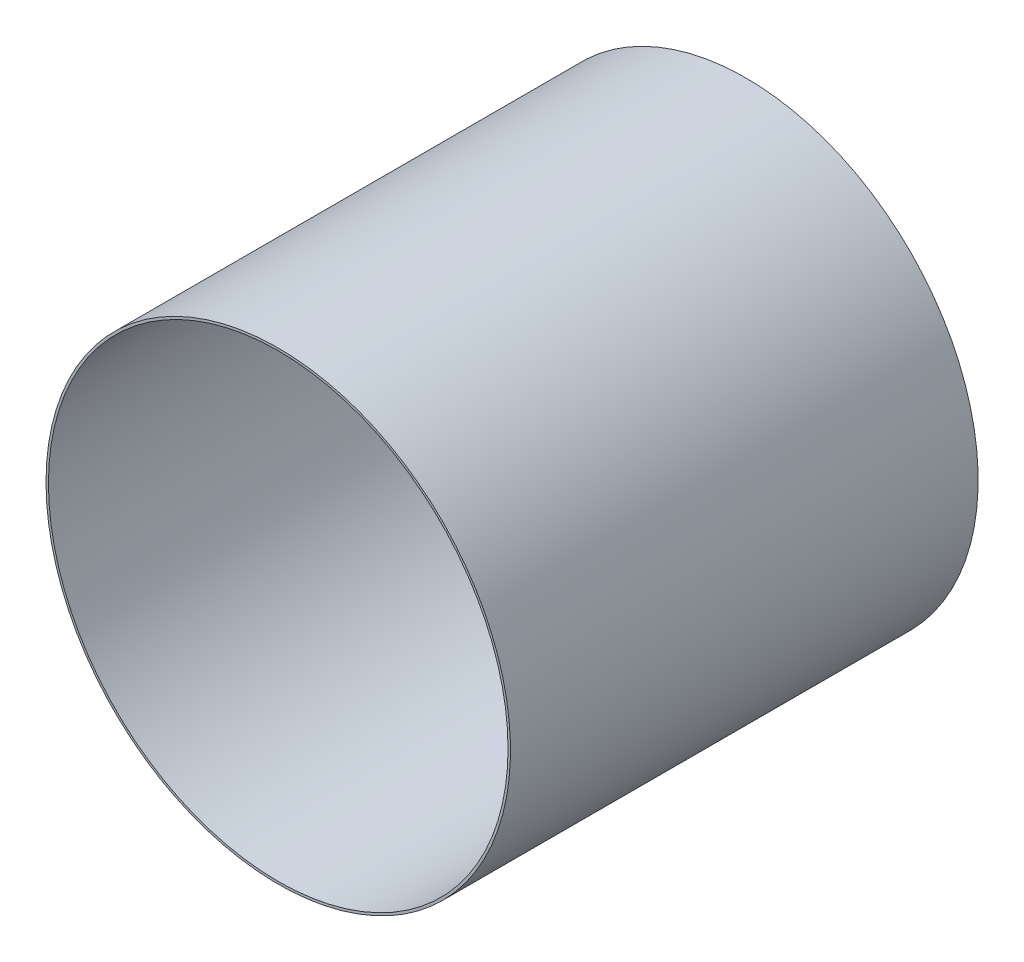
ISO-10303-21;
HEADER;
FILE_DESCRIPTION(('STEP AP214'),'2;1');
FILE_NAME('part.step','',(''),(''),'','','');
FILE_SCHEMA(('AUTOMOTIVE_DESIGN { 1 0 10303 214 1 1 1 1 }'));
ENDSEC;
DATA;
#1=APPLICATION_CONTEXT('core data for automotive mechanical design processes');
#2=APPLICATION_PROTOCOL_DEFINITION('international standard','automotive_design',2000,#1);
#3=PRODUCT_CONTEXT('',#1,'mechanical');
#4=PRODUCT('Part','Part','',(#3));
#5=PRODUCT_RELATED_PRODUCT_CATEGORY('part','',(#4));
#6=PRODUCT_DEFINITION_FORMATION('','',#4);
#7=PRODUCT_DEFINITION_CONTEXT('part definition',#1,'design');
#8=PRODUCT_DEFINITION('design','',#6,#7);
#9=PRODUCT_DEFINITION_SHAPE('','',#8);
#10=(LENGTH_UNIT() NAMED_UNIT(*) SI_UNIT(.MILLI.,.METRE.));
#11=(NAMED_UNIT(*) PLANE_ANGLE_UNIT() SI_UNIT($,.RADIAN.));
#12=(NAMED_UNIT(*) SI_UNIT($,.STERADIAN.) SOLID_ANGLE_UNIT());
#13=UNCERTAINTY_MEASURE_WITH_UNIT(LENGTH_MEASURE(1.E-05),#10,'distance_accuracy_value','');
#14=(GEOMETRIC_REPRESENTATION_CONTEXT(3) GLOBAL_UNCERTAINTY_ASSIGNED_CONTEXT((#13)) GLOBAL_UNIT_ASSIGNED_CONTEXT((#10,
#11,#12)) REPRESENTATION_CONTEXT('',''));
#15=CARTESIAN_POINT('',(0.,0.,0.));
#16=DIRECTION('',(0.,0.,1.));
#17=DIRECTION('',(1.,0.,0.));
#18=AXIS2_PLACEMENT_3D('',#15,#16,#17);
#19=CARTESIAN_POINT('',(0.,0.,0.));
#20=DIRECTION('',(0.,0.,1.));
#21=DIRECTION('',(1.,0.,0.));
#22=AXIS2_PLACEMENT_3D('',#19,#20,#21);
#23=CYLINDRICAL_SURFACE('',#22,288.);
#24=CARTESIAN_POINT('',(0.,0.,580.));
#25=DIRECTION('',(0.,0.,1.));
#26=DIRECTION('',(1.,0.,0.));
#27=AXIS2_PLACEMENT_3D('',#24,#25,#26);
#28=CIRCLE('',#27,288.);
#29=CARTESIAN_POINT('',(-288.,0.,580.));
#30=VERTEX_POINT('',#29);
#31=EDGE_CURVE('E28',#30,#30,#28,.T.);
#32=ORIENTED_EDGE('',*,*,#31,.F.);
#33=DIRECTION('',(0.,0.,-1.));
#34=VECTOR('',#33,1.);
#35=CARTESIAN_POINT('',(-288.,0.,0.));
#36=LINE('',#35,#34);
#37=CARTESIAN_POINT('',(-288.,0.,0.));
#38=VERTEX_POINT('',#37);
#39=EDGE_CURVE('E11',#30,#38,#36,.T.);
#40=ORIENTED_EDGE('',*,*,#39,.T.);
#41=CARTESIAN_POINT('',(0.,0.,0.));
#42=DIRECTION('',(0.,0.,1.));
#43=DIRECTION('',(1.,0.,0.));
#44=AXIS2_PLACEMENT_3D('',#41,#42,#43);
#45=CIRCLE('',#44,288.);
#46=EDGE_CURVE('E21',#38,#38,#45,.T.);
#47=ORIENTED_EDGE('',*,*,#46,.T.);
#48=ORIENTED_EDGE('',*,*,#39,.F.);
#49=EDGE_LOOP('',(#32,#40,#47,#48));
#50=FACE_BOUND('',#49,.T.);
#51=ADVANCED_FACE('F17',(#50),#23,.T.);
#52=CARTESIAN_POINT('',(0.,0.,580.));
#53=DIRECTION('',(0.,0.,1.));
#54=DIRECTION('',(1.,0.,0.));
#55=AXIS2_PLACEMENT_3D('',#52,#53,#54);
#56=PLANE('',#55);
#57=CARTESIAN_POINT('',(0.,0.,580.));
#58=DIRECTION('',(0.,0.,-1.));
#59=DIRECTION('',(1.,0.,0.));
#60=AXIS2_PLACEMENT_3D('',#57,#58,#59);
#61=CIRCLE('',#60,285.);
#62=CARTESIAN_POINT('',(-285.,0.,580.));
#63=VERTEX_POINT('',#62);
#64=EDGE_CURVE('E58',#63,#63,#61,.T.);
#65=ORIENTED_EDGE('',*,*,#64,.T.);
#66=EDGE_LOOP('',(#65));
#67=FACE_BOUND('',#66,.T.);
#68=ORIENTED_EDGE('',*,*,#31,.T.);
#69=EDGE_LOOP('',(#68));
#70=FACE_BOUND('',#69,.T.);
#71=ADVANCED_FACE('F19',(#67,#70),#56,.T.);
#72=CARTESIAN_POINT('',(0.,0.,0.));
#73=DIRECTION('',(0.,0.,1.));
#74=DIRECTION('',(1.,0.,0.));
#75=AXIS2_PLACEMENT_3D('',#72,#73,#74);
#76=CYLINDRICAL_SURFACE('',#75,285.);
#77=CARTESIAN_POINT('',(0.,0.,0.));
#78=DIRECTION('',(0.,0.,-1.));
#79=DIRECTION('',(1.,0.,0.));
#80=AXIS2_PLACEMENT_3D('',#77,#78,#79);
#81=CIRCLE('',#80,285.);
#82=CARTESIAN_POINT('',(-285.,0.,0.));
#83=VERTEX_POINT('',#82);
#84=EDGE_CURVE('E57',#83,#83,#81,.T.);
#85=ORIENTED_EDGE('',*,*,#84,.T.);
#86=DIRECTION('',(0.,0.,1.));
#87=VECTOR('',#86,1.);
#88=CARTESIAN_POINT('',(-285.,0.,0.));
#89=LINE('',#88,#87);
#90=EDGE_CURVE('E54',#83,#63,#89,.T.);
#91=ORIENTED_EDGE('',*,*,#90,.T.);
#92=ORIENTED_EDGE('',*,*,#64,.F.);
#93=ORIENTED_EDGE('',*,*,#90,.F.);
#94=EDGE_LOOP('',(#85,#91,#92,#93));
#95=FACE_BOUND('',#94,.T.);
#96=ADVANCED_FACE('F55',(#95),#76,.F.);
#97=CARTESIAN_POINT('',(0.,0.,0.));
#98=DIRECTION('',(0.,0.,1.));
#99=DIRECTION('',(1.,0.,0.));
#100=AXIS2_PLACEMENT_3D('',#97,#98,#99);
#101=PLANE('',#100);
#102=ORIENTED_EDGE('',*,*,#84,.F.);
#103=EDGE_LOOP('',(#102));
#104=FACE_BOUND('',#103,.T.);
#105=ORIENTED_EDGE('',*,*,#46,.F.);
#106=EDGE_LOOP('',(#105));
#107=FACE_BOUND('',#106,.T.);
#108=ADVANCED_FACE('F80',(#104,#107),#101,.F.);
#109=CLOSED_SHELL('',(#51,#71,#96,#108));
#110=MANIFOLD_SOLID_BREP('B1',#109);
#111=ADVANCED_BREP_SHAPE_REPRESENTATION('',(#18,#110),#14);
#112=SHAPE_DEFINITION_REPRESENTATION(#9,#111);
ENDSEC;
END-ISO-10303-21;
